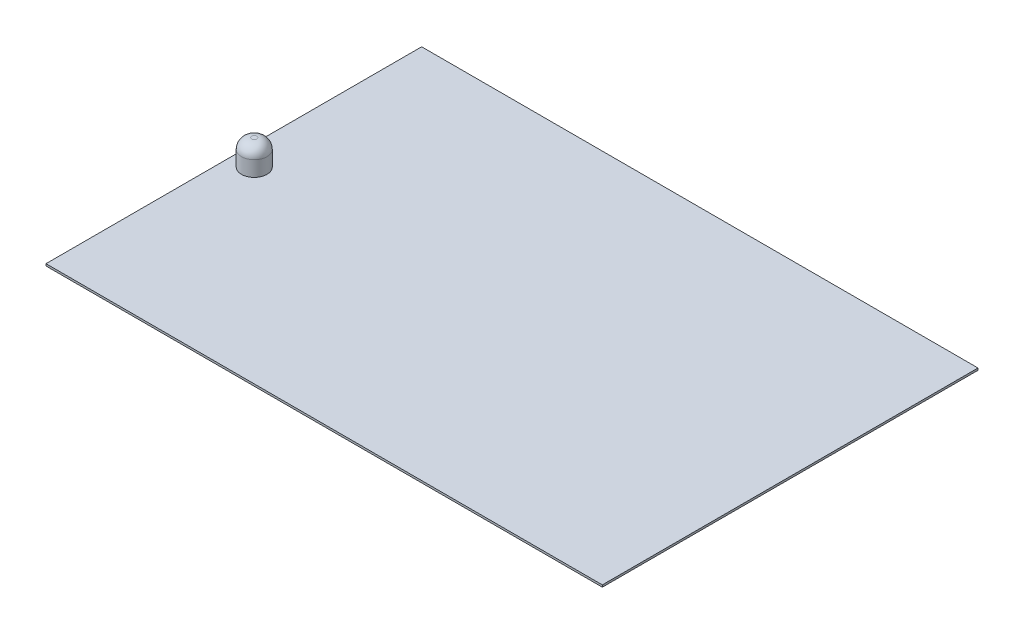
ISO-10303-21;
HEADER;
FILE_DESCRIPTION(('STEP AP214'),'2;1');
FILE_NAME('part.step','',(''),(''),'','','');
FILE_SCHEMA(('AUTOMOTIVE_DESIGN { 1 0 10303 214 1 1 1 1 }'));
ENDSEC;
DATA;
#1=APPLICATION_CONTEXT('core data for automotive mechanical design processes');
#2=APPLICATION_PROTOCOL_DEFINITION('international standard','automotive_design',2000,#1);
#3=PRODUCT_CONTEXT('',#1,'mechanical');
#4=PRODUCT('Part','Part','',(#3));
#5=PRODUCT_RELATED_PRODUCT_CATEGORY('part','',(#4));
#6=PRODUCT_DEFINITION_FORMATION('','',#4);
#7=PRODUCT_DEFINITION_CONTEXT('part definition',#1,'design');
#8=PRODUCT_DEFINITION('design','',#6,#7);
#9=PRODUCT_DEFINITION_SHAPE('','',#8);
#10=(LENGTH_UNIT() NAMED_UNIT(*) SI_UNIT(.MILLI.,.METRE.));
#11=(NAMED_UNIT(*) PLANE_ANGLE_UNIT() SI_UNIT($,.RADIAN.));
#12=(NAMED_UNIT(*) SI_UNIT($,.STERADIAN.) SOLID_ANGLE_UNIT());
#13=UNCERTAINTY_MEASURE_WITH_UNIT(LENGTH_MEASURE(1.E-05),#10,'distance_accuracy_value','');
#14=(GEOMETRIC_REPRESENTATION_CONTEXT(3) GLOBAL_UNCERTAINTY_ASSIGNED_CONTEXT((#13)) GLOBAL_UNIT_ASSIGNED_CONTEXT((#10,
#11,#12)) REPRESENTATION_CONTEXT('',''));
#15=CARTESIAN_POINT('',(0.,0.,0.));
#16=DIRECTION('',(0.,0.,1.));
#17=DIRECTION('',(1.,0.,0.));
#18=AXIS2_PLACEMENT_3D('',#15,#16,#17);
#19=CARTESIAN_POINT('',(-252.5,27.,0.));
#20=DIRECTION('',(0.,-1.,0.));
#21=DIRECTION('',(0.,0.,-1.));
#22=AXIS2_PLACEMENT_3D('',#19,#20,#21);
#23=CYLINDRICAL_SURFACE('',#22,12.5);
#24=CARTESIAN_POINT('',(-252.5,17.,0.));
#25=DIRECTION('',(0.,1.,0.));
#26=DIRECTION('',(0.,0.,1.));
#27=AXIS2_PLACEMENT_3D('',#24,#25,#26);
#28=CIRCLE('',#27,12.5);
#29=CARTESIAN_POINT('',(-252.5,17.,12.5000000000001));
#30=VERTEX_POINT('',#29);
#31=EDGE_CURVE('E11',#30,#30,#28,.F.);
#32=ORIENTED_EDGE('',*,*,#31,.T.);
#33=EDGE_LOOP('',(#32));
#34=FACE_BOUND('',#33,.T.);
#35=CARTESIAN_POINT('',(-252.5,2.,0.));
#36=DIRECTION('',(0.,1.,0.));
#37=DIRECTION('',(0.,0.,1.));
#38=AXIS2_PLACEMENT_3D('',#35,#36,#37);
#39=CIRCLE('',#38,12.5);
#40=CARTESIAN_POINT('',(-252.5,2.,12.5000000000001));
#41=VERTEX_POINT('',#40);
#42=EDGE_CURVE('E52',#41,#41,#39,.T.);
#43=ORIENTED_EDGE('',*,*,#42,.T.);
#44=EDGE_LOOP('',(#43));
#45=FACE_BOUND('',#44,.T.);
#46=ADVANCED_FACE('F41',(#34,#45),#23,.T.);
#47=CARTESIAN_POINT('',(-252.5,27.,0.));
#48=DIRECTION('',(0.,1.,0.));
#49=DIRECTION('',(0.,0.,1.));
#50=AXIS2_PLACEMENT_3D('',#47,#48,#49);
#51=PLANE('',#50);
#52=CARTESIAN_POINT('',(-252.5,27.,0.));
#53=DIRECTION('',(0.,1.,0.));
#54=DIRECTION('',(0.,0.,1.));
#55=AXIS2_PLACEMENT_3D('',#52,#53,#54);
#56=CIRCLE('',#55,2.5);
#57=CARTESIAN_POINT('',(-252.5,27.,2.50000000000006));
#58=VERTEX_POINT('',#57);
#59=EDGE_CURVE('E48',#58,#58,#56,.T.);
#60=ORIENTED_EDGE('',*,*,#59,.T.);
#61=EDGE_LOOP('',(#60));
#62=FACE_BOUND('',#61,.T.);
#63=ADVANCED_FACE('F62',(#62),#51,.T.);
#64=CARTESIAN_POINT('',(-252.5,2.,0.));
#65=DIRECTION('',(0.,1.,0.));
#66=DIRECTION('',(0.,0.,1.));
#67=AXIS2_PLACEMENT_3D('',#64,#65,#66);
#68=PLANE('',#67);
#69=ORIENTED_EDGE('',*,*,#42,.F.);
#70=EDGE_LOOP('',(#69));
#71=FACE_BOUND('',#70,.T.);
#72=ADVANCED_FACE('F60',(#71),#68,.F.);
#73=CARTESIAN_POINT('',(-252.5,17.,0.));
#74=DIRECTION('',(0.,1.,0.));
#75=DIRECTION('',(0.,0.,1.));
#76=AXIS2_PLACEMENT_3D('',#73,#74,#75);
#77=DEGENERATE_TOROIDAL_SURFACE('',#76,2.5,10.,.T.);
#78=ORIENTED_EDGE('',*,*,#31,.F.);
#79=EDGE_LOOP('',(#78));
#80=FACE_BOUND('',#79,.T.);
#81=ORIENTED_EDGE('',*,*,#59,.F.);
#82=EDGE_LOOP('',(#81));
#83=FACE_BOUND('',#82,.T.);
#84=ADVANCED_FACE('F43',(#80,#83),#77,.T.);
#85=CLOSED_SHELL('',(#46,#63,#72,#84));
#86=MANIFOLD_SOLID_BREP('B2',#85);
#87=CARTESIAN_POINT('',(-272.5,2.,184.));
#88=DIRECTION('',(1.,0.,0.));
#89=DIRECTION('',(0.,0.,-1.));
#90=AXIS2_PLACEMENT_3D('',#87,#88,#89);
#91=PLANE('',#90);
#92=DIRECTION('',(0.,0.,1.));
#93=VECTOR('',#92,1.);
#94=CARTESIAN_POINT('',(-272.5,0.,184.));
#95=LINE('',#94,#93);
#96=CARTESIAN_POINT('',(-272.5,0.,-184.));
#97=VERTEX_POINT('',#96);
#98=CARTESIAN_POINT('',(-272.5,0.,184.));
#99=VERTEX_POINT('',#98);
#100=EDGE_CURVE('E159',#97,#99,#95,.T.);
#101=ORIENTED_EDGE('',*,*,#100,.T.);
#102=DIRECTION('',(0.,-1.,0.));
#103=VECTOR('',#102,1.);
#104=CARTESIAN_POINT('',(-272.5,2.,184.));
#105=LINE('',#104,#103);
#106=CARTESIAN_POINT('',(-272.5,2.,184.));
#107=VERTEX_POINT('',#106);
#108=EDGE_CURVE('E39',#107,#99,#105,.T.);
#109=ORIENTED_EDGE('',*,*,#108,.F.);
#110=DIRECTION('',(0.,0.,1.));
#111=VECTOR('',#110,1.);
#112=CARTESIAN_POINT('',(-272.5,2.,184.));
#113=LINE('',#112,#111);
#114=CARTESIAN_POINT('',(-272.5,2.,-184.));
#115=VERTEX_POINT('',#114);
#116=EDGE_CURVE('E147',#115,#107,#113,.T.);
#117=ORIENTED_EDGE('',*,*,#116,.F.);
#118=DIRECTION('',(0.,-1.,0.));
#119=VECTOR('',#118,1.);
#120=CARTESIAN_POINT('',(-272.5,2.,-184.));
#121=LINE('',#120,#119);
#122=EDGE_CURVE('E155',#115,#97,#121,.T.);
#123=ORIENTED_EDGE('',*,*,#122,.T.);
#124=EDGE_LOOP('',(#101,#109,#117,#123));
#125=FACE_BOUND('',#124,.T.);
#126=ADVANCED_FACE('F96',(#125),#91,.F.);
#127=CARTESIAN_POINT('',(272.5,2.,184.));
#128=DIRECTION('',(0.,0.,-1.));
#129=DIRECTION('',(-1.,0.,0.));
#130=AXIS2_PLACEMENT_3D('',#127,#128,#129);
#131=PLANE('',#130);
#132=DIRECTION('',(1.,0.,0.));
#133=VECTOR('',#132,1.);
#134=CARTESIAN_POINT('',(272.5,0.,184.));
#135=LINE('',#134,#133);
#136=CARTESIAN_POINT('',(272.5,0.,184.));
#137=VERTEX_POINT('',#136);
#138=EDGE_CURVE('E151',#99,#137,#135,.T.);
#139=ORIENTED_EDGE('',*,*,#138,.T.);
#140=DIRECTION('',(0.,-1.,0.));
#141=VECTOR('',#140,1.);
#142=CARTESIAN_POINT('',(272.5,2.,184.));
#143=LINE('',#142,#141);
#144=CARTESIAN_POINT('',(272.5,2.,184.));
#145=VERTEX_POINT('',#144);
#146=EDGE_CURVE('E104',#145,#137,#143,.T.);
#147=ORIENTED_EDGE('',*,*,#146,.F.);
#148=DIRECTION('',(1.,0.,0.));
#149=VECTOR('',#148,1.);
#150=CARTESIAN_POINT('',(272.5,2.,184.));
#151=LINE('',#150,#149);
#152=EDGE_CURVE('E142',#107,#145,#151,.T.);
#153=ORIENTED_EDGE('',*,*,#152,.F.);
#154=ORIENTED_EDGE('',*,*,#108,.T.);
#155=EDGE_LOOP('',(#139,#147,#153,#154));
#156=FACE_BOUND('',#155,.T.);
#157=ADVANCED_FACE('F150',(#156),#131,.F.);
#158=CARTESIAN_POINT('',(272.5,2.,184.));
#159=DIRECTION('',(-1.,0.,0.));
#160=DIRECTION('',(0.,0.,1.));
#161=AXIS2_PLACEMENT_3D('',#158,#159,#160);
#162=PLANE('',#161);
#163=DIRECTION('',(0.,0.,-1.));
#164=VECTOR('',#163,1.);
#165=CARTESIAN_POINT('',(272.5,0.,184.));
#166=LINE('',#165,#164);
#167=CARTESIAN_POINT('',(272.5,0.,-184.));
#168=VERTEX_POINT('',#167);
#169=EDGE_CURVE('E129',#137,#168,#166,.T.);
#170=ORIENTED_EDGE('',*,*,#169,.T.);
#171=DIRECTION('',(0.,-1.,0.));
#172=VECTOR('',#171,1.);
#173=CARTESIAN_POINT('',(272.5,2.,-184.));
#174=LINE('',#173,#172);
#175=CARTESIAN_POINT('',(272.5,2.,-184.));
#176=VERTEX_POINT('',#175);
#177=EDGE_CURVE('E152',#176,#168,#174,.T.);
#178=ORIENTED_EDGE('',*,*,#177,.F.);
#179=DIRECTION('',(0.,0.,-1.));
#180=VECTOR('',#179,1.);
#181=CARTESIAN_POINT('',(272.5,2.,184.));
#182=LINE('',#181,#180);
#183=EDGE_CURVE('E145',#145,#176,#182,.T.);
#184=ORIENTED_EDGE('',*,*,#183,.F.);
#185=ORIENTED_EDGE('',*,*,#146,.T.);
#186=EDGE_LOOP('',(#170,#178,#184,#185));
#187=FACE_BOUND('',#186,.T.);
#188=ADVANCED_FACE('F153',(#187),#162,.F.);
#189=CARTESIAN_POINT('',(272.5,2.,-184.));
#190=DIRECTION('',(0.,0.,1.));
#191=DIRECTION('',(1.,0.,0.));
#192=AXIS2_PLACEMENT_3D('',#189,#190,#191);
#193=PLANE('',#192);
#194=DIRECTION('',(-1.,0.,0.));
#195=VECTOR('',#194,1.);
#196=CARTESIAN_POINT('',(272.5,0.,-184.));
#197=LINE('',#196,#195);
#198=EDGE_CURVE('E135',#168,#97,#197,.T.);
#199=ORIENTED_EDGE('',*,*,#198,.T.);
#200=ORIENTED_EDGE('',*,*,#122,.F.);
#201=DIRECTION('',(-1.,0.,0.));
#202=VECTOR('',#201,1.);
#203=CARTESIAN_POINT('',(272.5,2.,-184.));
#204=LINE('',#203,#202);
#205=EDGE_CURVE('E112',#176,#115,#204,.T.);
#206=ORIENTED_EDGE('',*,*,#205,.F.);
#207=ORIENTED_EDGE('',*,*,#177,.T.);
#208=EDGE_LOOP('',(#199,#200,#206,#207));
#209=FACE_BOUND('',#208,.T.);
#210=ADVANCED_FACE('F166',(#209),#193,.F.);
#211=CARTESIAN_POINT('',(-272.5,2.,-184.));
#212=DIRECTION('',(0.,1.,0.));
#213=DIRECTION('',(0.,0.,1.));
#214=AXIS2_PLACEMENT_3D('',#211,#212,#213);
#215=PLANE('',#214);
#216=ORIENTED_EDGE('',*,*,#116,.T.);
#217=ORIENTED_EDGE('',*,*,#152,.T.);
#218=ORIENTED_EDGE('',*,*,#183,.T.);
#219=ORIENTED_EDGE('',*,*,#205,.T.);
#220=EDGE_LOOP('',(#216,#217,#218,#219));
#221=FACE_BOUND('',#220,.T.);
#222=ADVANCED_FACE('F143',(#221),#215,.T.);
#223=CARTESIAN_POINT('',(-272.5,0.,-184.));
#224=DIRECTION('',(0.,1.,0.));
#225=DIRECTION('',(0.,0.,1.));
#226=AXIS2_PLACEMENT_3D('',#223,#224,#225);
#227=PLANE('',#226);
#228=ORIENTED_EDGE('',*,*,#100,.F.);
#229=ORIENTED_EDGE('',*,*,#198,.F.);
#230=ORIENTED_EDGE('',*,*,#169,.F.);
#231=ORIENTED_EDGE('',*,*,#138,.F.);
#232=EDGE_LOOP('',(#228,#229,#230,#231));
#233=FACE_BOUND('',#232,.T.);
#234=ADVANCED_FACE('F169',(#233),#227,.F.);
#235=CLOSED_SHELL('',(#126,#157,#188,#210,#222,#234));
#236=MANIFOLD_SOLID_BREP('B6',#235);
#237=ADVANCED_BREP_SHAPE_REPRESENTATION('',(#18,#86,#236),#14);
#238=SHAPE_DEFINITION_REPRESENTATION(#9,#237);
ENDSEC;
END-ISO-10303-21;
